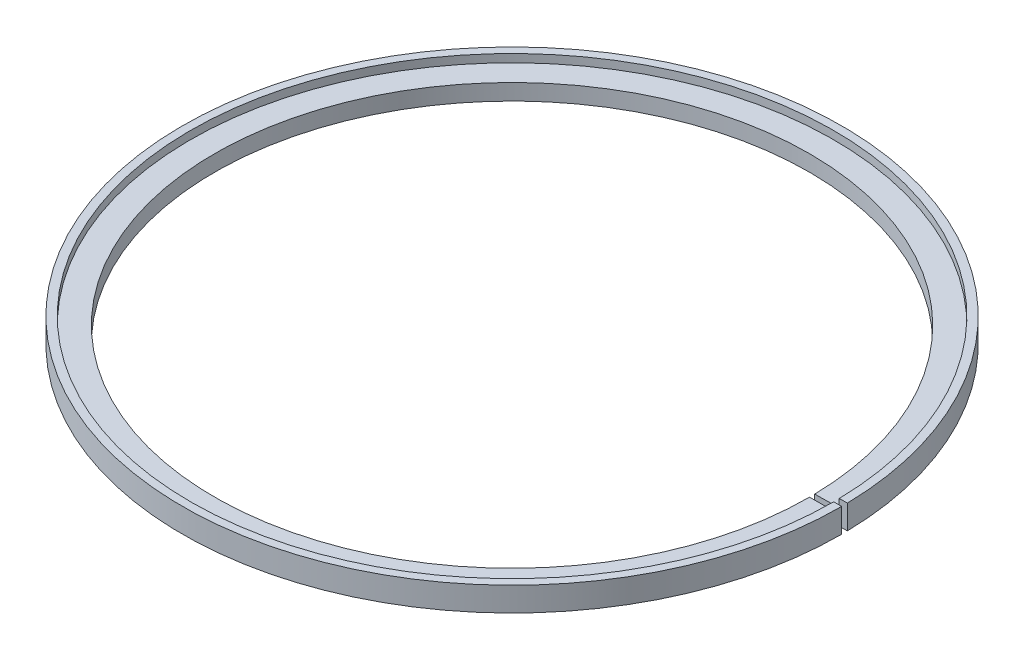
ISO-10303-21;
HEADER;
FILE_DESCRIPTION(('STEP AP214'),'2;1');
FILE_NAME('part.step','',(''),(''),'','','');
FILE_SCHEMA(('AUTOMOTIVE_DESIGN { 1 0 10303 214 1 1 1 1 }'));
ENDSEC;
DATA;
#1=APPLICATION_CONTEXT('core data for automotive mechanical design processes');
#2=APPLICATION_PROTOCOL_DEFINITION('international standard','automotive_design',2000,#1);
#3=PRODUCT_CONTEXT('',#1,'mechanical');
#4=PRODUCT('Part','Part','',(#3));
#5=PRODUCT_RELATED_PRODUCT_CATEGORY('part','',(#4));
#6=PRODUCT_DEFINITION_FORMATION('','',#4);
#7=PRODUCT_DEFINITION_CONTEXT('part definition',#1,'design');
#8=PRODUCT_DEFINITION('design','',#6,#7);
#9=PRODUCT_DEFINITION_SHAPE('','',#8);
#10=(LENGTH_UNIT() NAMED_UNIT(*) SI_UNIT(.MILLI.,.METRE.));
#11=(NAMED_UNIT(*) PLANE_ANGLE_UNIT() SI_UNIT($,.RADIAN.));
#12=(NAMED_UNIT(*) SI_UNIT($,.STERADIAN.) SOLID_ANGLE_UNIT());
#13=UNCERTAINTY_MEASURE_WITH_UNIT(LENGTH_MEASURE(1.E-05),#10,'distance_accuracy_value','');
#14=(GEOMETRIC_REPRESENTATION_CONTEXT(3) GLOBAL_UNCERTAINTY_ASSIGNED_CONTEXT((#13)) GLOBAL_UNIT_ASSIGNED_CONTEXT((#10,
#11,#12)) REPRESENTATION_CONTEXT('',''));
#15=CARTESIAN_POINT('',(0.,0.,0.));
#16=DIRECTION('',(0.,0.,1.));
#17=DIRECTION('',(1.,0.,0.));
#18=AXIS2_PLACEMENT_3D('',#15,#16,#17);
#19=CARTESIAN_POINT('',(0.,9.99999999999999,0.));
#20=DIRECTION('',(0.,1.,0.));
#21=DIRECTION('',(0.,0.,1.));
#22=AXIS2_PLACEMENT_3D('',#19,#20,#21);
#23=CYLINDRICAL_SURFACE('',#22,37.);
#24=CARTESIAN_POINT('',(0.,0.,0.));
#25=DIRECTION('',(0.,1.,0.));
#26=DIRECTION('',(0.,0.,1.));
#27=AXIS2_PLACEMENT_3D('',#24,#25,#26);
#28=CIRCLE('',#27,37.);
#29=CARTESIAN_POINT('',(36.9943647207865,0.,-0.645739038178966));
#30=VERTEX_POINT('',#29);
#31=CARTESIAN_POINT('',(37.,0.,0.));
#32=VERTEX_POINT('',#31);
#33=EDGE_CURVE('E11',#30,#32,#28,.T.);
#34=ORIENTED_EDGE('',*,*,#33,.F.);
#35=DIRECTION('',(0.,-1.,0.));
#36=VECTOR('',#35,1.);
#37=CARTESIAN_POINT('',(36.9943647207865,2.,-0.645739038178966));
#38=LINE('',#37,#36);
#39=CARTESIAN_POINT('',(36.9943647207865,2.,-0.645739038178966));
#40=VERTEX_POINT('',#39);
#41=EDGE_CURVE('E130',#40,#30,#38,.T.);
#42=ORIENTED_EDGE('',*,*,#41,.F.);
#43=CARTESIAN_POINT('',(0.,2.,0.));
#44=DIRECTION('',(0.,1.,0.));
#45=DIRECTION('',(0.,0.,1.));
#46=AXIS2_PLACEMENT_3D('',#43,#44,#45);
#47=CIRCLE('',#46,37.);
#48=CARTESIAN_POINT('',(37.,2.,0.));
#49=VERTEX_POINT('',#48);
#50=EDGE_CURVE('E57',#40,#49,#47,.T.);
#51=ORIENTED_EDGE('',*,*,#50,.T.);
#52=DIRECTION('',(0.,-1.,0.));
#53=VECTOR('',#52,1.);
#54=CARTESIAN_POINT('',(37.,2.,0.));
#55=LINE('',#54,#53);
#56=EDGE_CURVE('E105',#49,#32,#55,.T.);
#57=ORIENTED_EDGE('',*,*,#56,.T.);
#58=EDGE_LOOP('',(#34,#42,#51,#57));
#59=FACE_BOUND('',#58,.T.);
#60=ADVANCED_FACE('F41',(#59),#23,.F.);
#61=CARTESIAN_POINT('',(36.9943647207865,0.,-0.645739038178966));
#62=DIRECTION('',(0.,1.,0.));
#63=DIRECTION('',(0.,0.,1.));
#64=AXIS2_PLACEMENT_3D('',#61,#62,#63);
#65=PLANE('',#64);
#66=CARTESIAN_POINT('',(0.,0.,0.));
#67=DIRECTION('',(0.,1.,0.));
#68=DIRECTION('',(0.,0.,1.));
#69=AXIS2_PLACEMENT_3D('',#66,#67,#68);
#70=CIRCLE('',#69,41.);
#71=CARTESIAN_POINT('',(40.9937555014121,0.,-0.715548663928043));
#72=VERTEX_POINT('',#71);
#73=CARTESIAN_POINT('',(41.,0.,0.));
#74=VERTEX_POINT('',#73);
#75=EDGE_CURVE('E50',#72,#74,#70,.T.);
#76=ORIENTED_EDGE('',*,*,#75,.F.);
#77=DIRECTION('',(0.999847695156391,0.,-0.0174524064372693));
#78=VECTOR('',#77,1.);
#79=CARTESIAN_POINT('',(36.9943647207865,0.,-0.645739038178966));
#80=LINE('',#79,#78);
#81=EDGE_CURVE('E101',#30,#72,#80,.T.);
#82=ORIENTED_EDGE('',*,*,#81,.F.);
#83=ORIENTED_EDGE('',*,*,#33,.T.);
#84=DIRECTION('',(1.,0.,0.));
#85=VECTOR('',#84,1.);
#86=CARTESIAN_POINT('',(37.,0.,0.));
#87=LINE('',#86,#85);
#88=EDGE_CURVE('E98',#32,#74,#87,.T.);
#89=ORIENTED_EDGE('',*,*,#88,.T.);
#90=EDGE_LOOP('',(#76,#82,#83,#89));
#91=FACE_BOUND('',#90,.T.);
#92=ADVANCED_FACE('F43',(#91),#65,.F.);
#93=CARTESIAN_POINT('',(0.,9.99999999999999,0.));
#94=DIRECTION('',(0.,1.,0.));
#95=DIRECTION('',(0.,0.,1.));
#96=AXIS2_PLACEMENT_3D('',#93,#94,#95);
#97=CYLINDRICAL_SURFACE('',#96,41.);
#98=CARTESIAN_POINT('',(0.,3.,0.));
#99=DIRECTION('',(0.,1.,0.));
#100=DIRECTION('',(0.,0.,1.));
#101=AXIS2_PLACEMENT_3D('',#98,#99,#100);
#102=CIRCLE('',#101,41.);
#103=CARTESIAN_POINT('',(40.9937555014121,3.,-0.715548663928043));
#104=VERTEX_POINT('',#103);
#105=CARTESIAN_POINT('',(41.,3.,0.));
#106=VERTEX_POINT('',#105);
#107=EDGE_CURVE('E157',#104,#106,#102,.T.);
#108=ORIENTED_EDGE('',*,*,#107,.F.);
#109=DIRECTION('',(0.,1.,0.));
#110=VECTOR('',#109,1.);
#111=CARTESIAN_POINT('',(40.9937555014121,3.,-0.715548663928043));
#112=LINE('',#111,#110);
#113=EDGE_CURVE('E135',#72,#104,#112,.T.);
#114=ORIENTED_EDGE('',*,*,#113,.F.);
#115=ORIENTED_EDGE('',*,*,#75,.T.);
#116=DIRECTION('',(0.,1.,0.));
#117=VECTOR('',#116,1.);
#118=CARTESIAN_POINT('',(41.,3.,0.));
#119=LINE('',#118,#117);
#120=EDGE_CURVE('E113',#74,#106,#119,.T.);
#121=ORIENTED_EDGE('',*,*,#120,.T.);
#122=EDGE_LOOP('',(#108,#114,#115,#121));
#123=FACE_BOUND('',#122,.T.);
#124=ADVANCED_FACE('F163',(#123),#97,.T.);
#125=CARTESIAN_POINT('',(39.9939078062557,3.,-0.698096257490774));
#126=DIRECTION('',(0.,-1.,0.));
#127=DIRECTION('',(0.,0.,-1.));
#128=AXIS2_PLACEMENT_3D('',#125,#126,#127);
#129=PLANE('',#128);
#130=CARTESIAN_POINT('',(0.,3.,0.));
#131=DIRECTION('',(0.,1.,0.));
#132=DIRECTION('',(0.,0.,1.));
#133=AXIS2_PLACEMENT_3D('',#130,#131,#132);
#134=CIRCLE('',#133,40.);
#135=CARTESIAN_POINT('',(39.9939078062557,3.,-0.698096257490774));
#136=VERTEX_POINT('',#135);
#137=CARTESIAN_POINT('',(40.,3.,0.));
#138=VERTEX_POINT('',#137);
#139=EDGE_CURVE('E154',#136,#138,#134,.T.);
#140=ORIENTED_EDGE('',*,*,#139,.F.);
#141=DIRECTION('',(-0.999847695156391,0.,0.0174524064372693));
#142=VECTOR('',#141,1.);
#143=CARTESIAN_POINT('',(39.9939078062557,3.,-0.698096257490774));
#144=LINE('',#143,#142);
#145=EDGE_CURVE('E139',#104,#136,#144,.T.);
#146=ORIENTED_EDGE('',*,*,#145,.F.);
#147=ORIENTED_EDGE('',*,*,#107,.T.);
#148=DIRECTION('',(-1.,0.,0.));
#149=VECTOR('',#148,1.);
#150=CARTESIAN_POINT('',(40.,3.,0.));
#151=LINE('',#150,#149);
#152=EDGE_CURVE('E118',#106,#138,#151,.T.);
#153=ORIENTED_EDGE('',*,*,#152,.T.);
#154=EDGE_LOOP('',(#140,#146,#147,#153));
#155=FACE_BOUND('',#154,.T.);
#156=ADVANCED_FACE('F171',(#155),#129,.F.);
#157=CARTESIAN_POINT('',(0.,9.99999999999999,0.));
#158=DIRECTION('',(0.,1.,0.));
#159=DIRECTION('',(0.,0.,1.));
#160=AXIS2_PLACEMENT_3D('',#157,#158,#159);
#161=CYLINDRICAL_SURFACE('',#160,40.);
#162=CARTESIAN_POINT('',(0.,2.,0.));
#163=DIRECTION('',(0.,1.,0.));
#164=DIRECTION('',(0.,0.,1.));
#165=AXIS2_PLACEMENT_3D('',#162,#163,#164);
#166=CIRCLE('',#165,40.);
#167=CARTESIAN_POINT('',(39.9939078062557,2.,-0.698096257490774));
#168=VERTEX_POINT('',#167);
#169=CARTESIAN_POINT('',(40.,2.,0.));
#170=VERTEX_POINT('',#169);
#171=EDGE_CURVE('E65',#168,#170,#166,.T.);
#172=ORIENTED_EDGE('',*,*,#171,.F.);
#173=DIRECTION('',(0.,-1.,0.));
#174=VECTOR('',#173,1.);
#175=CARTESIAN_POINT('',(39.9939078062557,3.,-0.698096257490774));
#176=LINE('',#175,#174);
#177=EDGE_CURVE('E143',#136,#168,#176,.T.);
#178=ORIENTED_EDGE('',*,*,#177,.F.);
#179=ORIENTED_EDGE('',*,*,#139,.T.);
#180=DIRECTION('',(0.,-1.,0.));
#181=VECTOR('',#180,1.);
#182=CARTESIAN_POINT('',(40.,3.,0.));
#183=LINE('',#182,#181);
#184=EDGE_CURVE('E124',#138,#170,#183,.T.);
#185=ORIENTED_EDGE('',*,*,#184,.T.);
#186=EDGE_LOOP('',(#172,#178,#179,#185));
#187=FACE_BOUND('',#186,.T.);
#188=ADVANCED_FACE('F169',(#187),#161,.F.);
#189=CARTESIAN_POINT('',(36.9943647207865,2.,-0.645739038178966));
#190=DIRECTION('',(0.,-1.,0.));
#191=DIRECTION('',(0.,0.,-1.));
#192=AXIS2_PLACEMENT_3D('',#189,#190,#191);
#193=PLANE('',#192);
#194=DIRECTION('',(-0.999847695156391,0.,0.0174524064372693));
#195=VECTOR('',#194,1.);
#196=CARTESIAN_POINT('',(36.9943647207865,2.,-0.645739038178966));
#197=LINE('',#196,#195);
#198=EDGE_CURVE('E146',#168,#40,#197,.T.);
#199=ORIENTED_EDGE('',*,*,#198,.F.);
#200=ORIENTED_EDGE('',*,*,#171,.T.);
#201=DIRECTION('',(-1.,0.,0.));
#202=VECTOR('',#201,1.);
#203=CARTESIAN_POINT('',(37.,2.,0.));
#204=LINE('',#203,#202);
#205=EDGE_CURVE('E127',#170,#49,#204,.T.);
#206=ORIENTED_EDGE('',*,*,#205,.T.);
#207=ORIENTED_EDGE('',*,*,#50,.F.);
#208=EDGE_LOOP('',(#199,#200,#206,#207));
#209=FACE_BOUND('',#208,.T.);
#210=ADVANCED_FACE('F167',(#209),#193,.F.);
#211=CARTESIAN_POINT('',(36.9943647207865,0.,-0.645739038178966));
#212=DIRECTION('',(0.0174524064372693,0.,0.999847695156391));
#213=DIRECTION('',(0.999847695156391,0.,-0.0174524064372693));
#214=AXIS2_PLACEMENT_3D('',#211,#212,#213);
#215=PLANE('',#214);
#216=ORIENTED_EDGE('',*,*,#41,.T.);
#217=ORIENTED_EDGE('',*,*,#81,.T.);
#218=ORIENTED_EDGE('',*,*,#113,.T.);
#219=ORIENTED_EDGE('',*,*,#145,.T.);
#220=ORIENTED_EDGE('',*,*,#177,.T.);
#221=ORIENTED_EDGE('',*,*,#198,.T.);
#222=EDGE_LOOP('',(#216,#217,#218,#219,#220,#221));
#223=FACE_BOUND('',#222,.T.);
#224=ADVANCED_FACE('F165',(#223),#215,.T.);
#225=CARTESIAN_POINT('',(37.,0.,0.));
#226=DIRECTION('',(0.,0.,1.));
#227=DIRECTION('',(1.,0.,0.));
#228=AXIS2_PLACEMENT_3D('',#225,#226,#227);
#229=PLANE('',#228);
#230=ORIENTED_EDGE('',*,*,#56,.F.);
#231=ORIENTED_EDGE('',*,*,#205,.F.);
#232=ORIENTED_EDGE('',*,*,#184,.F.);
#233=ORIENTED_EDGE('',*,*,#152,.F.);
#234=ORIENTED_EDGE('',*,*,#120,.F.);
#235=ORIENTED_EDGE('',*,*,#88,.F.);
#236=EDGE_LOOP('',(#230,#231,#232,#233,#234,#235));
#237=FACE_BOUND('',#236,.T.);
#238=ADVANCED_FACE('F110',(#237),#229,.F.);
#239=CLOSED_SHELL('',(#60,#92,#124,#156,#188,#210,#224,#238));
#240=MANIFOLD_SOLID_BREP('B2',#239);
#241=ADVANCED_BREP_SHAPE_REPRESENTATION('',(#18,#240),#14);
#242=SHAPE_DEFINITION_REPRESENTATION(#9,#241);
ENDSEC;
END-ISO-10303-21;
